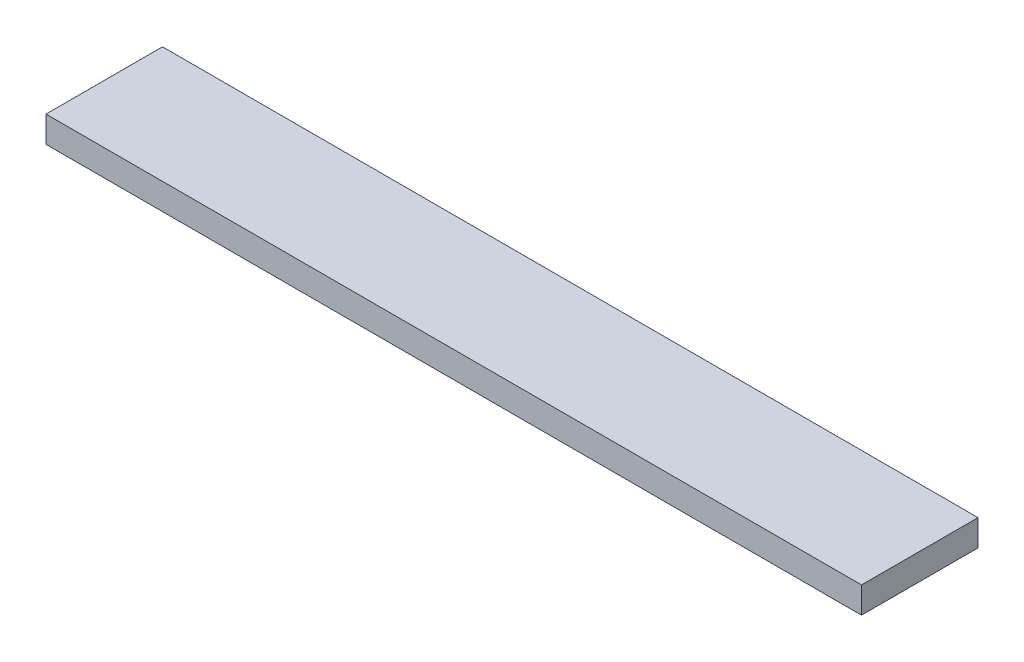
ISO-10303-21;
HEADER;
FILE_DESCRIPTION(('STEP AP214'),'2;1');
FILE_NAME('part.step','',(''),(''),'','','');
FILE_SCHEMA(('AUTOMOTIVE_DESIGN { 1 0 10303 214 1 1 1 1 }'));
ENDSEC;
DATA;
#1=APPLICATION_CONTEXT('core data for automotive mechanical design processes');
#2=APPLICATION_PROTOCOL_DEFINITION('international standard','automotive_design',2000,#1);
#3=PRODUCT_CONTEXT('',#1,'mechanical');
#4=PRODUCT('Part','Part','',(#3));
#5=PRODUCT_RELATED_PRODUCT_CATEGORY('part','',(#4));
#6=PRODUCT_DEFINITION_FORMATION('','',#4);
#7=PRODUCT_DEFINITION_CONTEXT('part definition',#1,'design');
#8=PRODUCT_DEFINITION('design','',#6,#7);
#9=PRODUCT_DEFINITION_SHAPE('','',#8);
#10=(LENGTH_UNIT() NAMED_UNIT(*) SI_UNIT(.MILLI.,.METRE.));
#11=(NAMED_UNIT(*) PLANE_ANGLE_UNIT() SI_UNIT($,.RADIAN.));
#12=(NAMED_UNIT(*) SI_UNIT($,.STERADIAN.) SOLID_ANGLE_UNIT());
#13=UNCERTAINTY_MEASURE_WITH_UNIT(LENGTH_MEASURE(1.E-05),#10,'distance_accuracy_value','');
#14=(GEOMETRIC_REPRESENTATION_CONTEXT(3) GLOBAL_UNCERTAINTY_ASSIGNED_CONTEXT((#13)) GLOBAL_UNIT_ASSIGNED_CONTEXT((#10,
#11,#12)) REPRESENTATION_CONTEXT('',''));
#15=CARTESIAN_POINT('',(0.,0.,0.));
#16=DIRECTION('',(0.,0.,1.));
#17=DIRECTION('',(1.,0.,0.));
#18=AXIS2_PLACEMENT_3D('',#15,#16,#17);
#19=CARTESIAN_POINT('',(0.,4.5,0.));
#20=DIRECTION('',(1.,0.,0.));
#21=DIRECTION('',(0.,0.,-1.));
#22=AXIS2_PLACEMENT_3D('',#19,#20,#21);
#23=PLANE('',#22);
#24=DIRECTION('',(0.,0.,1.));
#25=VECTOR('',#24,1.);
#26=CARTESIAN_POINT('',(0.,0.,0.));
#27=LINE('',#26,#25);
#28=CARTESIAN_POINT('',(0.,0.,-20.));
#29=VERTEX_POINT('',#28);
#30=CARTESIAN_POINT('',(0.,0.,0.));
#31=VERTEX_POINT('',#30);
#32=EDGE_CURVE('E97',#29,#31,#27,.T.);
#33=ORIENTED_EDGE('',*,*,#32,.T.);
#34=DIRECTION('',(0.,-1.,0.));
#35=VECTOR('',#34,1.);
#36=CARTESIAN_POINT('',(0.,4.5,0.));
#37=LINE('',#36,#35);
#38=CARTESIAN_POINT('',(0.,4.5,0.));
#39=VERTEX_POINT('',#38);
#40=EDGE_CURVE('E11',#39,#31,#37,.T.);
#41=ORIENTED_EDGE('',*,*,#40,.F.);
#42=DIRECTION('',(0.,0.,1.));
#43=VECTOR('',#42,1.);
#44=CARTESIAN_POINT('',(0.,4.5,0.));
#45=LINE('',#44,#43);
#46=CARTESIAN_POINT('',(0.,4.5,-20.));
#47=VERTEX_POINT('',#46);
#48=EDGE_CURVE('E85',#47,#39,#45,.T.);
#49=ORIENTED_EDGE('',*,*,#48,.F.);
#50=DIRECTION('',(0.,-1.,0.));
#51=VECTOR('',#50,1.);
#52=CARTESIAN_POINT('',(0.,4.5,-20.));
#53=LINE('',#52,#51);
#54=EDGE_CURVE('E93',#47,#29,#53,.T.);
#55=ORIENTED_EDGE('',*,*,#54,.T.);
#56=EDGE_LOOP('',(#33,#41,#49,#55));
#57=FACE_BOUND('',#56,.T.);
#58=ADVANCED_FACE('F34',(#57),#23,.F.);
#59=CARTESIAN_POINT('',(0.,4.5,0.));
#60=DIRECTION('',(0.,0.,-1.));
#61=DIRECTION('',(-1.,0.,0.));
#62=AXIS2_PLACEMENT_3D('',#59,#60,#61);
#63=PLANE('',#62);
#64=DIRECTION('',(1.,0.,0.));
#65=VECTOR('',#64,1.);
#66=CARTESIAN_POINT('',(0.,0.,0.));
#67=LINE('',#66,#65);
#68=CARTESIAN_POINT('',(140.,0.,0.));
#69=VERTEX_POINT('',#68);
#70=EDGE_CURVE('E89',#31,#69,#67,.T.);
#71=ORIENTED_EDGE('',*,*,#70,.T.);
#72=DIRECTION('',(0.,-1.,0.));
#73=VECTOR('',#72,1.);
#74=CARTESIAN_POINT('',(140.,4.5,0.));
#75=LINE('',#74,#73);
#76=CARTESIAN_POINT('',(140.,4.5,0.));
#77=VERTEX_POINT('',#76);
#78=EDGE_CURVE('E42',#77,#69,#75,.T.);
#79=ORIENTED_EDGE('',*,*,#78,.F.);
#80=DIRECTION('',(1.,0.,0.));
#81=VECTOR('',#80,1.);
#82=CARTESIAN_POINT('',(0.,4.5,0.));
#83=LINE('',#82,#81);
#84=EDGE_CURVE('E80',#39,#77,#83,.T.);
#85=ORIENTED_EDGE('',*,*,#84,.F.);
#86=ORIENTED_EDGE('',*,*,#40,.T.);
#87=EDGE_LOOP('',(#71,#79,#85,#86));
#88=FACE_BOUND('',#87,.T.);
#89=ADVANCED_FACE('F88',(#88),#63,.F.);
#90=CARTESIAN_POINT('',(140.,4.5,0.));
#91=DIRECTION('',(-1.,0.,0.));
#92=DIRECTION('',(0.,0.,1.));
#93=AXIS2_PLACEMENT_3D('',#90,#91,#92);
#94=PLANE('',#93);
#95=DIRECTION('',(0.,0.,-1.));
#96=VECTOR('',#95,1.);
#97=CARTESIAN_POINT('',(140.,0.,0.));
#98=LINE('',#97,#96);
#99=CARTESIAN_POINT('',(140.,0.,-20.));
#100=VERTEX_POINT('',#99);
#101=EDGE_CURVE('E67',#69,#100,#98,.T.);
#102=ORIENTED_EDGE('',*,*,#101,.T.);
#103=DIRECTION('',(0.,-1.,0.));
#104=VECTOR('',#103,1.);
#105=CARTESIAN_POINT('',(140.,4.5,-20.));
#106=LINE('',#105,#104);
#107=CARTESIAN_POINT('',(140.,4.5,-20.));
#108=VERTEX_POINT('',#107);
#109=EDGE_CURVE('E90',#108,#100,#106,.T.);
#110=ORIENTED_EDGE('',*,*,#109,.F.);
#111=DIRECTION('',(0.,0.,-1.));
#112=VECTOR('',#111,1.);
#113=CARTESIAN_POINT('',(140.,4.5,0.));
#114=LINE('',#113,#112);
#115=EDGE_CURVE('E83',#77,#108,#114,.T.);
#116=ORIENTED_EDGE('',*,*,#115,.F.);
#117=ORIENTED_EDGE('',*,*,#78,.T.);
#118=EDGE_LOOP('',(#102,#110,#116,#117));
#119=FACE_BOUND('',#118,.T.);
#120=ADVANCED_FACE('F91',(#119),#94,.F.);
#121=CARTESIAN_POINT('',(0.,4.5,-20.));
#122=DIRECTION('',(0.,0.,1.));
#123=DIRECTION('',(1.,0.,0.));
#124=AXIS2_PLACEMENT_3D('',#121,#122,#123);
#125=PLANE('',#124);
#126=DIRECTION('',(-1.,0.,0.));
#127=VECTOR('',#126,1.);
#128=CARTESIAN_POINT('',(0.,0.,-20.));
#129=LINE('',#128,#127);
#130=EDGE_CURVE('E73',#100,#29,#129,.T.);
#131=ORIENTED_EDGE('',*,*,#130,.T.);
#132=ORIENTED_EDGE('',*,*,#54,.F.);
#133=DIRECTION('',(-1.,0.,0.));
#134=VECTOR('',#133,1.);
#135=CARTESIAN_POINT('',(0.,4.5,-20.));
#136=LINE('',#135,#134);
#137=EDGE_CURVE('E50',#108,#47,#136,.T.);
#138=ORIENTED_EDGE('',*,*,#137,.F.);
#139=ORIENTED_EDGE('',*,*,#109,.T.);
#140=EDGE_LOOP('',(#131,#132,#138,#139));
#141=FACE_BOUND('',#140,.T.);
#142=ADVANCED_FACE('F104',(#141),#125,.F.);
#143=CARTESIAN_POINT('',(0.,4.5,0.));
#144=DIRECTION('',(0.,-1.,0.));
#145=DIRECTION('',(0.,0.,-1.));
#146=AXIS2_PLACEMENT_3D('',#143,#144,#145);
#147=PLANE('',#146);
#148=ORIENTED_EDGE('',*,*,#48,.T.);
#149=ORIENTED_EDGE('',*,*,#84,.T.);
#150=ORIENTED_EDGE('',*,*,#115,.T.);
#151=ORIENTED_EDGE('',*,*,#137,.T.);
#152=EDGE_LOOP('',(#148,#149,#150,#151));
#153=FACE_BOUND('',#152,.T.);
#154=ADVANCED_FACE('F81',(#153),#147,.F.);
#155=CARTESIAN_POINT('',(0.,0.,0.));
#156=DIRECTION('',(0.,-1.,0.));
#157=DIRECTION('',(0.,0.,-1.));
#158=AXIS2_PLACEMENT_3D('',#155,#156,#157);
#159=PLANE('',#158);
#160=ORIENTED_EDGE('',*,*,#32,.F.);
#161=ORIENTED_EDGE('',*,*,#130,.F.);
#162=ORIENTED_EDGE('',*,*,#101,.F.);
#163=ORIENTED_EDGE('',*,*,#70,.F.);
#164=EDGE_LOOP('',(#160,#161,#162,#163));
#165=FACE_BOUND('',#164,.T.);
#166=ADVANCED_FACE('F107',(#165),#159,.T.);
#167=CLOSED_SHELL('',(#58,#89,#120,#142,#154,#166));
#168=MANIFOLD_SOLID_BREP('B2',#167);
#169=ADVANCED_BREP_SHAPE_REPRESENTATION('',(#18,#168),#14);
#170=SHAPE_DEFINITION_REPRESENTATION(#9,#169);
ENDSEC;
END-ISO-10303-21;
